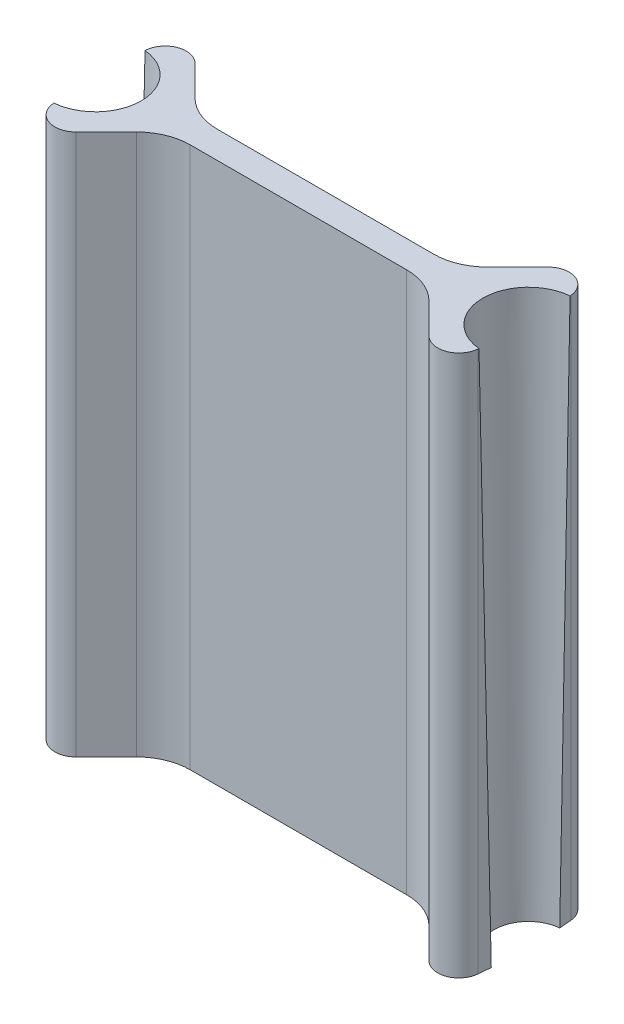
ISO-10303-21;
HEADER;
FILE_DESCRIPTION(('STEP AP214'),'2;1');
FILE_NAME('part.step','',(''),(''),'','','');
FILE_SCHEMA(('AUTOMOTIVE_DESIGN { 1 0 10303 214 1 1 1 1 }'));
ENDSEC;
DATA;
#1=APPLICATION_CONTEXT('core data for automotive mechanical design processes');
#2=APPLICATION_PROTOCOL_DEFINITION('international standard','automotive_design',2000,#1);
#3=PRODUCT_CONTEXT('',#1,'mechanical');
#4=PRODUCT('Part','Part','',(#3));
#5=PRODUCT_RELATED_PRODUCT_CATEGORY('part','',(#4));
#6=PRODUCT_DEFINITION_FORMATION('','',#4);
#7=PRODUCT_DEFINITION_CONTEXT('part definition',#1,'design');
#8=PRODUCT_DEFINITION('design','',#6,#7);
#9=PRODUCT_DEFINITION_SHAPE('','',#8);
#10=(LENGTH_UNIT() NAMED_UNIT(*) SI_UNIT(.MILLI.,.METRE.));
#11=(NAMED_UNIT(*) PLANE_ANGLE_UNIT() SI_UNIT($,.RADIAN.));
#12=(NAMED_UNIT(*) SI_UNIT($,.STERADIAN.) SOLID_ANGLE_UNIT());
#13=UNCERTAINTY_MEASURE_WITH_UNIT(LENGTH_MEASURE(1.E-05),#10,'distance_accuracy_value','');
#14=(GEOMETRIC_REPRESENTATION_CONTEXT(3) GLOBAL_UNCERTAINTY_ASSIGNED_CONTEXT((#13)) GLOBAL_UNIT_ASSIGNED_CONTEXT((#10,
#11,#12)) REPRESENTATION_CONTEXT('',''));
#15=CARTESIAN_POINT('',(0.,0.,0.));
#16=DIRECTION('',(0.,0.,1.));
#17=DIRECTION('',(1.,0.,0.));
#18=AXIS2_PLACEMENT_3D('',#15,#16,#17);
#19=CARTESIAN_POINT('',(7.93923101204884,10.,-0.694592710667681));
#20=DIRECTION('',(-0.996194698091746,0.,0.087155742747653));
#21=DIRECTION('',(0.087155742747653,0.,0.996194698091746));
#22=AXIS2_PLACEMENT_3D('',#19,#20,#21);
#23=PLANE('',#22);
#24=DIRECTION('',(-0.087155742747653,0.,-0.996194698091746));
#25=VECTOR('',#24,1.);
#26=CARTESIAN_POINT('',(7.93923101204884,10.,-0.694592710667681));
#27=LINE('',#26,#25);
#28=CARTESIAN_POINT('',(7.92639957779882,10.,-0.841256675264834));
#29=VERTEX_POINT('',#28);
#30=CARTESIAN_POINT('',(7.92488614141223,10.,-0.858555332320465));
#31=VERTEX_POINT('',#30);
#32=EDGE_CURVE('E133',#29,#31,#27,.T.);
#33=ORIENTED_EDGE('',*,*,#32,.F.);
#34=DIRECTION('',(0.0018252521598672,-0.999780683474845,0.0208627276530114));
#35=VECTOR('',#34,1.);
#36=CARTESIAN_POINT('',(8.,-30.3145833930611,0.));
#37=LINE('',#36,#35);
#38=CARTESIAN_POINT('',(7.94465610335524,0.,-0.632583633288258));
#39=VERTEX_POINT('',#38);
#40=EDGE_CURVE('E441',#39,#29,#37,.F.);
#41=ORIENTED_EDGE('',*,*,#40,.F.);
#42=DIRECTION('',(-0.087155742747653,0.,-0.996194698091746));
#43=VECTOR('',#42,1.);
#44=CARTESIAN_POINT('',(7.93923101204884,0.,-0.694592710667681));
#45=LINE('',#44,#43);
#46=CARTESIAN_POINT('',(7.92488614141223,0.,-0.858555332320465));
#47=VERTEX_POINT('',#46);
#48=EDGE_CURVE('E211',#39,#47,#45,.T.);
#49=ORIENTED_EDGE('',*,*,#48,.T.);
#50=DIRECTION('',(0.,-1.,0.));
#51=VECTOR('',#50,1.);
#52=CARTESIAN_POINT('',(7.92488614141223,10.,-0.858555332320465));
#53=LINE('',#52,#51);
#54=EDGE_CURVE('E11',#31,#47,#53,.T.);
#55=ORIENTED_EDGE('',*,*,#54,.F.);
#56=EDGE_LOOP('',(#33,#41,#49,#55));
#57=FACE_BOUND('',#56,.T.);
#58=ADVANCED_FACE('F43',(#57),#23,.F.);
#59=CARTESIAN_POINT('',(7.53691050638378,10.,-0.824611862531205));
#60=DIRECTION('',(0.,-1.,0.));
#61=DIRECTION('',(0.,0.,-1.));
#62=AXIS2_PLACEMENT_3D('',#59,#60,#61);
#63=CYLINDRICAL_SURFACE('',#62,0.389457638925042);
#64=CARTESIAN_POINT('',(7.53691050638378,0.,-0.824611862531205));
#65=DIRECTION('',(0.,1.,0.));
#66=DIRECTION('',(0.,0.,1.));
#67=AXIS2_PLACEMENT_3D('',#64,#65,#66);
#68=CIRCLE('',#67,0.389457638925042);
#69=CARTESIAN_POINT('',(7.26152236891497,0.,-1.1));
#70=VERTEX_POINT('',#69);
#71=EDGE_CURVE('E215',#47,#70,#68,.T.);
#72=ORIENTED_EDGE('',*,*,#71,.T.);
#73=DIRECTION('',(0.,-1.,0.));
#74=VECTOR('',#73,1.);
#75=CARTESIAN_POINT('',(7.26152236891497,10.,-1.1));
#76=LINE('',#75,#74);
#77=CARTESIAN_POINT('',(7.26152236891497,10.,-1.1));
#78=VERTEX_POINT('',#77);
#79=EDGE_CURVE('E52',#78,#70,#76,.T.);
#80=ORIENTED_EDGE('',*,*,#79,.F.);
#81=CARTESIAN_POINT('',(7.53691050638378,10.,-0.824611862531205));
#82=DIRECTION('',(0.,1.,0.));
#83=DIRECTION('',(0.,0.,1.));
#84=AXIS2_PLACEMENT_3D('',#81,#82,#83);
#85=CIRCLE('',#84,0.389457638925042);
#86=EDGE_CURVE('E345',#31,#78,#85,.T.);
#87=ORIENTED_EDGE('',*,*,#86,.F.);
#88=ORIENTED_EDGE('',*,*,#54,.T.);
#89=EDGE_LOOP('',(#72,#80,#87,#88));
#90=FACE_BOUND('',#89,.T.);
#91=ADVANCED_FACE('F434',(#90),#63,.T.);
#92=CARTESIAN_POINT('',(3.08076118445751,10.,3.08076118445749));
#93=DIRECTION('',(0.70710678118655,0.,0.707106781186545));
#94=DIRECTION('',(0.707106781186545,0.,-0.70710678118655));
#95=AXIS2_PLACEMENT_3D('',#92,#93,#94);
#96=PLANE('',#95);
#97=DIRECTION('',(-0.707106781186545,0.,0.70710678118655));
#98=VECTOR('',#97,1.);
#99=CARTESIAN_POINT('',(3.08076118445751,0.,3.08076118445749));
#100=LINE('',#99,#98);
#101=CARTESIAN_POINT('',(6.70251262658471,0.,-0.540990257669735));
#102=VERTEX_POINT('',#101);
#103=EDGE_CURVE('E219',#70,#102,#100,.T.);
#104=ORIENTED_EDGE('',*,*,#103,.T.);
#105=DIRECTION('',(0.,-1.,0.));
#106=VECTOR('',#105,1.);
#107=CARTESIAN_POINT('',(6.70251262658471,10.,-0.540990257669735));
#108=LINE('',#107,#106);
#109=CARTESIAN_POINT('',(6.70251262658471,10.,-0.540990257669735));
#110=VERTEX_POINT('',#109);
#111=EDGE_CURVE('E312',#110,#102,#108,.T.);
#112=ORIENTED_EDGE('',*,*,#111,.F.);
#113=DIRECTION('',(-0.707106781186545,0.,0.70710678118655));
#114=VECTOR('',#113,1.);
#115=CARTESIAN_POINT('',(3.08076118445751,10.,3.08076118445749));
#116=LINE('',#115,#114);
#117=EDGE_CURVE('E323',#78,#110,#116,.T.);
#118=ORIENTED_EDGE('',*,*,#117,.F.);
#119=ORIENTED_EDGE('',*,*,#79,.T.);
#120=EDGE_LOOP('',(#104,#112,#118,#119));
#121=FACE_BOUND('',#120,.T.);
#122=ADVANCED_FACE('F321',(#121),#96,.F.);
#123=CARTESIAN_POINT('',(6.,10.,-1.24350288425444));
#124=DIRECTION('',(0.,-1.,0.));
#125=DIRECTION('',(0.,0.,-1.));
#126=AXIS2_PLACEMENT_3D('',#123,#124,#125);
#127=CYLINDRICAL_SURFACE('',#126,0.993502884254442);
#128=CARTESIAN_POINT('',(6.,0.,-1.24350288425444));
#129=DIRECTION('',(0.,1.,0.));
#130=DIRECTION('',(0.,0.,1.));
#131=AXIS2_PLACEMENT_3D('',#128,#129,#130);
#132=CIRCLE('',#131,0.993502884254442);
#133=CARTESIAN_POINT('',(6.,0.,-0.249999999999999));
#134=VERTEX_POINT('',#133);
#135=EDGE_CURVE('E222',#102,#134,#132,.F.);
#136=ORIENTED_EDGE('',*,*,#135,.T.);
#137=DIRECTION('',(0.,-1.,0.));
#138=VECTOR('',#137,1.);
#139=CARTESIAN_POINT('',(6.,10.,-0.249999999999999));
#140=LINE('',#139,#138);
#141=CARTESIAN_POINT('',(6.,10.,-0.249999999999999));
#142=VERTEX_POINT('',#141);
#143=EDGE_CURVE('E309',#142,#134,#140,.T.);
#144=ORIENTED_EDGE('',*,*,#143,.F.);
#145=CARTESIAN_POINT('',(6.,10.,-1.24350288425444));
#146=DIRECTION('',(0.,1.,0.));
#147=DIRECTION('',(0.,0.,1.));
#148=AXIS2_PLACEMENT_3D('',#145,#146,#147);
#149=CIRCLE('',#148,0.993502884254442);
#150=EDGE_CURVE('E336',#110,#142,#149,.F.);
#151=ORIENTED_EDGE('',*,*,#150,.F.);
#152=ORIENTED_EDGE('',*,*,#111,.T.);
#153=EDGE_LOOP('',(#136,#144,#151,#152));
#154=FACE_BOUND('',#153,.T.);
#155=ADVANCED_FACE('F333',(#154),#127,.F.);
#156=CARTESIAN_POINT('',(0.,10.,-0.25));
#157=DIRECTION('',(0.,0.,-1.));
#158=DIRECTION('',(-1.,0.,0.));
#159=AXIS2_PLACEMENT_3D('',#156,#157,#158);
#160=PLANE('',#159);
#161=DIRECTION('',(1.,0.,0.));
#162=VECTOR('',#161,1.);
#163=CARTESIAN_POINT('',(0.,0.,-0.25));
#164=LINE('',#163,#162);
#165=CARTESIAN_POINT('',(2.,0.,-0.25));
#166=VERTEX_POINT('',#165);
#167=EDGE_CURVE('E226',#166,#134,#164,.T.);
#168=ORIENTED_EDGE('',*,*,#167,.F.);
#169=DIRECTION('',(0.,-1.,0.));
#170=VECTOR('',#169,1.);
#171=CARTESIAN_POINT('',(2.,10.,-0.25));
#172=LINE('',#171,#170);
#173=CARTESIAN_POINT('',(2.,10.,-0.25));
#174=VERTEX_POINT('',#173);
#175=EDGE_CURVE('E306',#174,#166,#172,.T.);
#176=ORIENTED_EDGE('',*,*,#175,.F.);
#177=DIRECTION('',(1.,0.,0.));
#178=VECTOR('',#177,1.);
#179=CARTESIAN_POINT('',(0.,10.,-0.25));
#180=LINE('',#179,#178);
#181=EDGE_CURVE('E339',#174,#142,#180,.T.);
#182=ORIENTED_EDGE('',*,*,#181,.T.);
#183=ORIENTED_EDGE('',*,*,#143,.T.);
#184=EDGE_LOOP('',(#168,#176,#182,#183));
#185=FACE_BOUND('',#184,.T.);
#186=ADVANCED_FACE('F475',(#185),#160,.T.);
#187=CARTESIAN_POINT('',(2.,10.,-1.24350288425444));
#188=DIRECTION('',(0.,-1.,0.));
#189=DIRECTION('',(0.,0.,-1.));
#190=AXIS2_PLACEMENT_3D('',#187,#188,#189);
#191=CYLINDRICAL_SURFACE('',#190,0.993502884254442);
#192=CARTESIAN_POINT('',(2.,0.,-1.24350288425444));
#193=DIRECTION('',(0.,1.,0.));
#194=DIRECTION('',(0.,0.,1.));
#195=AXIS2_PLACEMENT_3D('',#192,#193,#194);
#196=CIRCLE('',#195,0.993502884254442);
#197=CARTESIAN_POINT('',(1.29748737341529,0.,-0.540990257669733));
#198=VERTEX_POINT('',#197);
#199=EDGE_CURVE('E230',#198,#166,#196,.T.);
#200=ORIENTED_EDGE('',*,*,#199,.F.);
#201=DIRECTION('',(0.,-1.,0.));
#202=VECTOR('',#201,1.);
#203=CARTESIAN_POINT('',(1.29748737341529,10.,-0.540990257669733));
#204=LINE('',#203,#202);
#205=CARTESIAN_POINT('',(1.29748737341529,10.,-0.540990257669733));
#206=VERTEX_POINT('',#205);
#207=EDGE_CURVE('E303',#206,#198,#204,.T.);
#208=ORIENTED_EDGE('',*,*,#207,.F.);
#209=CARTESIAN_POINT('',(2.,10.,-1.24350288425444));
#210=DIRECTION('',(0.,1.,0.));
#211=DIRECTION('',(0.,0.,1.));
#212=AXIS2_PLACEMENT_3D('',#209,#210,#211);
#213=CIRCLE('',#212,0.993502884254442);
#214=EDGE_CURVE('E343',#206,#174,#213,.T.);
#215=ORIENTED_EDGE('',*,*,#214,.T.);
#216=ORIENTED_EDGE('',*,*,#175,.T.);
#217=EDGE_LOOP('',(#200,#208,#215,#216));
#218=FACE_BOUND('',#217,.T.);
#219=ADVANCED_FACE('F473',(#218),#191,.F.);
#220=CARTESIAN_POINT('',(0.919238815542513,10.,-0.919238815542511));
#221=DIRECTION('',(0.707106781186548,0.,-0.707106781186547));
#222=DIRECTION('',(-0.707106781186547,0.,-0.707106781186548));
#223=AXIS2_PLACEMENT_3D('',#220,#221,#222);
#224=PLANE('',#223);
#225=DIRECTION('',(0.707106781186547,0.,0.707106781186548));
#226=VECTOR('',#225,1.);
#227=CARTESIAN_POINT('',(0.919238815542513,0.,-0.919238815542511));
#228=LINE('',#227,#226);
#229=CARTESIAN_POINT('',(0.738477631085024,0.,-1.1));
#230=VERTEX_POINT('',#229);
#231=EDGE_CURVE('E234',#230,#198,#228,.T.);
#232=ORIENTED_EDGE('',*,*,#231,.F.);
#233=DIRECTION('',(0.,-1.,0.));
#234=VECTOR('',#233,1.);
#235=CARTESIAN_POINT('',(0.738477631085024,10.,-1.1));
#236=LINE('',#235,#234);
#237=CARTESIAN_POINT('',(0.738477631085024,10.,-1.1));
#238=VERTEX_POINT('',#237);
#239=EDGE_CURVE('E300',#238,#230,#236,.T.);
#240=ORIENTED_EDGE('',*,*,#239,.F.);
#241=DIRECTION('',(0.707106781186547,0.,0.707106781186548));
#242=VECTOR('',#241,1.);
#243=CARTESIAN_POINT('',(0.919238815542513,10.,-0.919238815542511));
#244=LINE('',#243,#242);
#245=EDGE_CURVE('E352',#238,#206,#244,.T.);
#246=ORIENTED_EDGE('',*,*,#245,.T.);
#247=ORIENTED_EDGE('',*,*,#207,.T.);
#248=EDGE_LOOP('',(#232,#240,#246,#247));
#249=FACE_BOUND('',#248,.T.);
#250=ADVANCED_FACE('F471',(#249),#224,.T.);
#251=CARTESIAN_POINT('',(0.463089493616225,10.,-0.824611862531202));
#252=DIRECTION('',(0.,-1.,0.));
#253=DIRECTION('',(0.,0.,-1.));
#254=AXIS2_PLACEMENT_3D('',#251,#252,#253);
#255=CYLINDRICAL_SURFACE('',#254,0.389457638925041);
#256=CARTESIAN_POINT('',(0.463089493616225,0.,-0.824611862531202));
#257=DIRECTION('',(0.,1.,0.));
#258=DIRECTION('',(0.,0.,1.));
#259=AXIS2_PLACEMENT_3D('',#256,#257,#258);
#260=CIRCLE('',#259,0.389457638925041);
#261=CARTESIAN_POINT('',(0.0751138585877695,0.,-0.858555332320462));
#262=VERTEX_POINT('',#261);
#263=EDGE_CURVE('E238',#262,#230,#260,.F.);
#264=ORIENTED_EDGE('',*,*,#263,.F.);
#265=DIRECTION('',(0.,-1.,0.));
#266=VECTOR('',#265,1.);
#267=CARTESIAN_POINT('',(0.0751138585877695,10.,-0.858555332320462));
#268=LINE('',#267,#266);
#269=CARTESIAN_POINT('',(0.0751138585877695,10.,-0.858555332320462));
#270=VERTEX_POINT('',#269);
#271=EDGE_CURVE('E297',#270,#262,#268,.T.);
#272=ORIENTED_EDGE('',*,*,#271,.F.);
#273=CARTESIAN_POINT('',(0.463089493616225,10.,-0.824611862531202));
#274=DIRECTION('',(0.,1.,0.));
#275=DIRECTION('',(0.,0.,1.));
#276=AXIS2_PLACEMENT_3D('',#273,#274,#275);
#277=CIRCLE('',#276,0.389457638925041);
#278=EDGE_CURVE('E356',#270,#238,#277,.F.);
#279=ORIENTED_EDGE('',*,*,#278,.T.);
#280=ORIENTED_EDGE('',*,*,#239,.T.);
#281=EDGE_LOOP('',(#264,#272,#279,#280));
#282=FACE_BOUND('',#281,.T.);
#283=ADVANCED_FACE('F467',(#282),#255,.T.);
#284=CARTESIAN_POINT('',(0.,10.,0.));
#285=DIRECTION('',(-0.996194698091746,0.,-0.0871557427476544));
#286=DIRECTION('',(-0.0871557427476544,0.,0.996194698091746));
#287=AXIS2_PLACEMENT_3D('',#284,#285,#286);
#288=PLANE('',#287);
#289=DIRECTION('',(-0.00182525215986723,-0.999780683474846,0.0208627276530114));
#290=VECTOR('',#289,1.);
#291=CARTESIAN_POINT('',(0.,-30.3145833930611,0.));
#292=LINE('',#291,#290);
#293=CARTESIAN_POINT('',(0.0553438966447605,0.,-0.632583633288259));
#294=VERTEX_POINT('',#293);
#295=CARTESIAN_POINT('',(0.0736004222011792,10.,-0.841256675264832));
#296=VERTEX_POINT('',#295);
#297=EDGE_CURVE('E407',#294,#296,#292,.F.);
#298=ORIENTED_EDGE('',*,*,#297,.T.);
#299=DIRECTION('',(0.0871557427476544,0.,-0.996194698091746));
#300=VECTOR('',#299,1.);
#301=CARTESIAN_POINT('',(0.,10.,0.));
#302=LINE('',#301,#300);
#303=EDGE_CURVE('E360',#296,#270,#302,.T.);
#304=ORIENTED_EDGE('',*,*,#303,.T.);
#305=ORIENTED_EDGE('',*,*,#271,.T.);
#306=DIRECTION('',(0.0871557427476544,0.,-0.996194698091746));
#307=VECTOR('',#306,1.);
#308=CARTESIAN_POINT('',(0.,0.,0.));
#309=LINE('',#308,#307);
#310=EDGE_CURVE('E242',#294,#262,#309,.T.);
#311=ORIENTED_EDGE('',*,*,#310,.F.);
#312=EDGE_LOOP('',(#298,#304,#305,#311));
#313=FACE_BOUND('',#312,.T.);
#314=ADVANCED_FACE('F460',(#313),#288,.T.);
#315=CARTESIAN_POINT('',(0.,10.,0.));
#316=DIRECTION('',(0.996194698091746,0.,-0.0871557427476544));
#317=DIRECTION('',(-0.0871557427476544,0.,-0.996194698091746));
#318=AXIS2_PLACEMENT_3D('',#315,#316,#317);
#319=PLANE('',#318);
#320=DIRECTION('',(0.0871557427476544,0.,0.996194698091746));
#321=VECTOR('',#320,1.);
#322=CARTESIAN_POINT('',(0.,10.,0.));
#323=LINE('',#322,#321);
#324=CARTESIAN_POINT('',(0.0736004222011792,10.,0.841256675264832));
#325=VERTEX_POINT('',#324);
#326=CARTESIAN_POINT('',(0.0751138585877695,10.,0.858555332320462));
#327=VERTEX_POINT('',#326);
#328=EDGE_CURVE('E363',#325,#327,#323,.T.);
#329=ORIENTED_EDGE('',*,*,#328,.F.);
#330=DIRECTION('',(-0.00182525215986723,-0.999780683474846,-0.0208627276530114));
#331=VECTOR('',#330,1.);
#332=CARTESIAN_POINT('',(0.,-30.3145833930611,0.));
#333=LINE('',#332,#331);
#334=CARTESIAN_POINT('',(0.0553438966447605,0.,0.632583633288259));
#335=VERTEX_POINT('',#334);
#336=EDGE_CURVE('E405',#335,#325,#333,.F.);
#337=ORIENTED_EDGE('',*,*,#336,.F.);
#338=DIRECTION('',(0.0871557427476544,0.,0.996194698091746));
#339=VECTOR('',#338,1.);
#340=CARTESIAN_POINT('',(0.,0.,0.));
#341=LINE('',#340,#339);
#342=CARTESIAN_POINT('',(0.0751138585877695,0.,0.858555332320462));
#343=VERTEX_POINT('',#342);
#344=EDGE_CURVE('E246',#335,#343,#341,.T.);
#345=ORIENTED_EDGE('',*,*,#344,.T.);
#346=DIRECTION('',(0.,-1.,0.));
#347=VECTOR('',#346,1.);
#348=CARTESIAN_POINT('',(0.0751138585877695,10.,0.858555332320462));
#349=LINE('',#348,#347);
#350=EDGE_CURVE('E293',#327,#343,#349,.T.);
#351=ORIENTED_EDGE('',*,*,#350,.F.);
#352=EDGE_LOOP('',(#329,#337,#345,#351));
#353=FACE_BOUND('',#352,.T.);
#354=ADVANCED_FACE('F413',(#353),#319,.F.);
#355=CARTESIAN_POINT('',(0.463089493616225,10.,0.824611862531202));
#356=DIRECTION('',(0.,-1.,0.));
#357=DIRECTION('',(0.,0.,-1.));
#358=AXIS2_PLACEMENT_3D('',#355,#356,#357);
#359=CYLINDRICAL_SURFACE('',#358,0.389457638925041);
#360=CARTESIAN_POINT('',(0.463089493616225,0.,0.824611862531202));
#361=DIRECTION('',(0.,1.,0.));
#362=DIRECTION('',(0.,0.,1.));
#363=AXIS2_PLACEMENT_3D('',#360,#361,#362);
#364=CIRCLE('',#363,0.389457638925041);
#365=CARTESIAN_POINT('',(0.738477631085024,0.,1.1));
#366=VERTEX_POINT('',#365);
#367=EDGE_CURVE('E249',#343,#366,#364,.T.);
#368=ORIENTED_EDGE('',*,*,#367,.T.);
#369=DIRECTION('',(0.,-1.,0.));
#370=VECTOR('',#369,1.);
#371=CARTESIAN_POINT('',(0.738477631085024,10.,1.1));
#372=LINE('',#371,#370);
#373=CARTESIAN_POINT('',(0.738477631085024,10.,1.1));
#374=VERTEX_POINT('',#373);
#375=EDGE_CURVE('E289',#374,#366,#372,.T.);
#376=ORIENTED_EDGE('',*,*,#375,.F.);
#377=CARTESIAN_POINT('',(0.463089493616225,10.,0.824611862531202));
#378=DIRECTION('',(0.,1.,0.));
#379=DIRECTION('',(0.,0.,1.));
#380=AXIS2_PLACEMENT_3D('',#377,#378,#379);
#381=CIRCLE('',#380,0.389457638925041);
#382=EDGE_CURVE('E366',#327,#374,#381,.T.);
#383=ORIENTED_EDGE('',*,*,#382,.F.);
#384=ORIENTED_EDGE('',*,*,#350,.T.);
#385=EDGE_LOOP('',(#368,#376,#383,#384));
#386=FACE_BOUND('',#385,.T.);
#387=ADVANCED_FACE('F421',(#386),#359,.T.);
#388=CARTESIAN_POINT('',(0.919238815542512,10.,0.919238815542512));
#389=DIRECTION('',(-0.707106781186548,0.,-0.707106781186547));
#390=DIRECTION('',(-0.707106781186547,0.,0.707106781186548));
#391=AXIS2_PLACEMENT_3D('',#388,#389,#390);
#392=PLANE('',#391);
#393=DIRECTION('',(0.707106781186547,0.,-0.707106781186548));
#394=VECTOR('',#393,1.);
#395=CARTESIAN_POINT('',(0.919238815542512,0.,0.919238815542512));
#396=LINE('',#395,#394);
#397=CARTESIAN_POINT('',(1.29748737341529,0.,0.540990257669734));
#398=VERTEX_POINT('',#397);
#399=EDGE_CURVE('E252',#366,#398,#396,.T.);
#400=ORIENTED_EDGE('',*,*,#399,.T.);
#401=DIRECTION('',(0.,-1.,0.));
#402=VECTOR('',#401,1.);
#403=CARTESIAN_POINT('',(1.29748737341529,10.,0.540990257669734));
#404=LINE('',#403,#402);
#405=CARTESIAN_POINT('',(1.29748737341529,10.,0.540990257669734));
#406=VERTEX_POINT('',#405);
#407=EDGE_CURVE('E285',#406,#398,#404,.T.);
#408=ORIENTED_EDGE('',*,*,#407,.F.);
#409=DIRECTION('',(0.707106781186547,0.,-0.707106781186548));
#410=VECTOR('',#409,1.);
#411=CARTESIAN_POINT('',(0.919238815542512,10.,0.919238815542512));
#412=LINE('',#411,#410);
#413=EDGE_CURVE('E369',#374,#406,#412,.T.);
#414=ORIENTED_EDGE('',*,*,#413,.F.);
#415=ORIENTED_EDGE('',*,*,#375,.T.);
#416=EDGE_LOOP('',(#400,#408,#414,#415));
#417=FACE_BOUND('',#416,.T.);
#418=ADVANCED_FACE('F424',(#417),#392,.F.);
#419=CARTESIAN_POINT('',(2.,10.,1.24350288425444));
#420=DIRECTION('',(0.,-1.,0.));
#421=DIRECTION('',(0.,0.,-1.));
#422=AXIS2_PLACEMENT_3D('',#419,#420,#421);
#423=CYLINDRICAL_SURFACE('',#422,0.993502884254442);
#424=CARTESIAN_POINT('',(2.,0.,1.24350288425444));
#425=DIRECTION('',(0.,1.,0.));
#426=DIRECTION('',(0.,0.,1.));
#427=AXIS2_PLACEMENT_3D('',#424,#425,#426);
#428=CIRCLE('',#427,0.993502884254442);
#429=CARTESIAN_POINT('',(2.,0.,0.25));
#430=VERTEX_POINT('',#429);
#431=EDGE_CURVE('E255',#398,#430,#428,.F.);
#432=ORIENTED_EDGE('',*,*,#431,.T.);
#433=DIRECTION('',(0.,-1.,0.));
#434=VECTOR('',#433,1.);
#435=CARTESIAN_POINT('',(2.,10.,0.25));
#436=LINE('',#435,#434);
#437=CARTESIAN_POINT('',(2.,10.,0.25));
#438=VERTEX_POINT('',#437);
#439=EDGE_CURVE('E281',#438,#430,#436,.T.);
#440=ORIENTED_EDGE('',*,*,#439,.F.);
#441=CARTESIAN_POINT('',(2.,10.,1.24350288425444));
#442=DIRECTION('',(0.,1.,0.));
#443=DIRECTION('',(0.,0.,1.));
#444=AXIS2_PLACEMENT_3D('',#441,#442,#443);
#445=CIRCLE('',#444,0.993502884254442);
#446=EDGE_CURVE('E372',#406,#438,#445,.F.);
#447=ORIENTED_EDGE('',*,*,#446,.F.);
#448=ORIENTED_EDGE('',*,*,#407,.T.);
#449=EDGE_LOOP('',(#432,#440,#447,#448));
#450=FACE_BOUND('',#449,.T.);
#451=ADVANCED_FACE('F380',(#450),#423,.F.);
#452=CARTESIAN_POINT('',(0.,10.,0.25));
#453=DIRECTION('',(0.,0.,-1.));
#454=DIRECTION('',(-1.,0.,0.));
#455=AXIS2_PLACEMENT_3D('',#452,#453,#454);
#456=PLANE('',#455);
#457=DIRECTION('',(1.,0.,0.));
#458=VECTOR('',#457,1.);
#459=CARTESIAN_POINT('',(0.,0.,0.25));
#460=LINE('',#459,#458);
#461=CARTESIAN_POINT('',(6.,0.,0.249999999999999));
#462=VERTEX_POINT('',#461);
#463=EDGE_CURVE('E258',#430,#462,#460,.T.);
#464=ORIENTED_EDGE('',*,*,#463,.T.);
#465=DIRECTION('',(0.,-1.,0.));
#466=VECTOR('',#465,1.);
#467=CARTESIAN_POINT('',(6.,10.,0.249999999999999));
#468=LINE('',#467,#466);
#469=CARTESIAN_POINT('',(6.,10.,0.249999999999999));
#470=VERTEX_POINT('',#469);
#471=EDGE_CURVE('E187',#470,#462,#468,.T.);
#472=ORIENTED_EDGE('',*,*,#471,.F.);
#473=DIRECTION('',(1.,0.,0.));
#474=VECTOR('',#473,1.);
#475=CARTESIAN_POINT('',(0.,10.,0.25));
#476=LINE('',#475,#474);
#477=EDGE_CURVE('E197',#438,#470,#476,.T.);
#478=ORIENTED_EDGE('',*,*,#477,.F.);
#479=ORIENTED_EDGE('',*,*,#439,.T.);
#480=EDGE_LOOP('',(#464,#472,#478,#479));
#481=FACE_BOUND('',#480,.T.);
#482=ADVANCED_FACE('F384',(#481),#456,.F.);
#483=CARTESIAN_POINT('',(6.,10.,1.24350288425444));
#484=DIRECTION('',(0.,-1.,0.));
#485=DIRECTION('',(0.,0.,-1.));
#486=AXIS2_PLACEMENT_3D('',#483,#484,#485);
#487=CYLINDRICAL_SURFACE('',#486,0.993502884254441);
#488=CARTESIAN_POINT('',(6.,0.,1.24350288425444));
#489=DIRECTION('',(0.,1.,0.));
#490=DIRECTION('',(0.,0.,1.));
#491=AXIS2_PLACEMENT_3D('',#488,#489,#490);
#492=CIRCLE('',#491,0.993502884254441);
#493=CARTESIAN_POINT('',(6.70251262658471,0.,0.540990257669735));
#494=VERTEX_POINT('',#493);
#495=EDGE_CURVE('E181',#494,#462,#492,.T.);
#496=ORIENTED_EDGE('',*,*,#495,.F.);
#497=DIRECTION('',(0.,-1.,0.));
#498=VECTOR('',#497,1.);
#499=CARTESIAN_POINT('',(6.70251262658471,10.,0.540990257669735));
#500=LINE('',#499,#498);
#501=CARTESIAN_POINT('',(6.70251262658471,10.,0.540990257669735));
#502=VERTEX_POINT('',#501);
#503=EDGE_CURVE('E176',#502,#494,#500,.T.);
#504=ORIENTED_EDGE('',*,*,#503,.F.);
#505=CARTESIAN_POINT('',(6.,10.,1.24350288425444));
#506=DIRECTION('',(0.,1.,0.));
#507=DIRECTION('',(0.,0.,1.));
#508=AXIS2_PLACEMENT_3D('',#505,#506,#507);
#509=CIRCLE('',#508,0.993502884254441);
#510=EDGE_CURVE('E179',#502,#470,#509,.T.);
#511=ORIENTED_EDGE('',*,*,#510,.T.);
#512=ORIENTED_EDGE('',*,*,#471,.T.);
#513=EDGE_LOOP('',(#496,#504,#511,#512));
#514=FACE_BOUND('',#513,.T.);
#515=ADVANCED_FACE('F178',(#514),#487,.F.);
#516=CARTESIAN_POINT('',(3.08076118445751,10.,-3.08076118445749));
#517=DIRECTION('',(-0.70710678118655,0.,0.707106781186545));
#518=DIRECTION('',(0.707106781186545,0.,0.70710678118655));
#519=AXIS2_PLACEMENT_3D('',#516,#517,#518);
#520=PLANE('',#519);
#521=DIRECTION('',(-0.707106781186545,0.,-0.70710678118655));
#522=VECTOR('',#521,1.);
#523=CARTESIAN_POINT('',(3.08076118445751,0.,-3.08076118445749));
#524=LINE('',#523,#522);
#525=CARTESIAN_POINT('',(7.26152236891497,0.,1.1));
#526=VERTEX_POINT('',#525);
#527=EDGE_CURVE('E264',#526,#494,#524,.T.);
#528=ORIENTED_EDGE('',*,*,#527,.F.);
#529=DIRECTION('',(0.,-1.,0.));
#530=VECTOR('',#529,1.);
#531=CARTESIAN_POINT('',(7.26152236891497,10.,1.1));
#532=LINE('',#531,#530);
#533=CARTESIAN_POINT('',(7.26152236891497,10.,1.1));
#534=VERTEX_POINT('',#533);
#535=EDGE_CURVE('E188',#534,#526,#532,.T.);
#536=ORIENTED_EDGE('',*,*,#535,.F.);
#537=DIRECTION('',(-0.707106781186545,0.,-0.70710678118655));
#538=VECTOR('',#537,1.);
#539=CARTESIAN_POINT('',(3.08076118445751,10.,-3.08076118445749));
#540=LINE('',#539,#538);
#541=EDGE_CURVE('E194',#534,#502,#540,.T.);
#542=ORIENTED_EDGE('',*,*,#541,.T.);
#543=ORIENTED_EDGE('',*,*,#503,.T.);
#544=EDGE_LOOP('',(#528,#536,#542,#543));
#545=FACE_BOUND('',#544,.T.);
#546=ADVANCED_FACE('F201',(#545),#520,.T.);
#547=CARTESIAN_POINT('',(7.53691050638378,10.,0.824611862531203));
#548=DIRECTION('',(0.,-1.,0.));
#549=DIRECTION('',(0.,0.,-1.));
#550=AXIS2_PLACEMENT_3D('',#547,#548,#549);
#551=CYLINDRICAL_SURFACE('',#550,0.389457638925043);
#552=CARTESIAN_POINT('',(7.53691050638378,0.,0.824611862531203));
#553=DIRECTION('',(0.,1.,0.));
#554=DIRECTION('',(0.,0.,1.));
#555=AXIS2_PLACEMENT_3D('',#552,#553,#554);
#556=CIRCLE('',#555,0.389457638925043);
#557=CARTESIAN_POINT('',(7.92488614141223,0.,0.858555332320465));
#558=VERTEX_POINT('',#557);
#559=EDGE_CURVE('E267',#558,#526,#556,.F.);
#560=ORIENTED_EDGE('',*,*,#559,.F.);
#561=DIRECTION('',(0.,-1.,0.));
#562=VECTOR('',#561,1.);
#563=CARTESIAN_POINT('',(7.92488614141223,10.,0.858555332320465));
#564=LINE('',#563,#562);
#565=CARTESIAN_POINT('',(7.92488614141223,10.,0.858555332320465));
#566=VERTEX_POINT('',#565);
#567=EDGE_CURVE('E117',#566,#558,#564,.T.);
#568=ORIENTED_EDGE('',*,*,#567,.F.);
#569=CARTESIAN_POINT('',(7.53691050638378,10.,0.824611862531203));
#570=DIRECTION('',(0.,1.,0.));
#571=DIRECTION('',(0.,0.,1.));
#572=AXIS2_PLACEMENT_3D('',#569,#570,#571);
#573=CIRCLE('',#572,0.389457638925043);
#574=EDGE_CURVE('E203',#566,#534,#573,.F.);
#575=ORIENTED_EDGE('',*,*,#574,.T.);
#576=ORIENTED_EDGE('',*,*,#535,.T.);
#577=EDGE_LOOP('',(#560,#568,#575,#576));
#578=FACE_BOUND('',#577,.T.);
#579=ADVANCED_FACE('F386',(#578),#551,.T.);
#580=CARTESIAN_POINT('',(7.93923101204884,10.,0.694592710667681));
#581=DIRECTION('',(0.996194698091746,0.,0.087155742747653));
#582=DIRECTION('',(0.087155742747653,0.,-0.996194698091746));
#583=AXIS2_PLACEMENT_3D('',#580,#581,#582);
#584=PLANE('',#583);
#585=DIRECTION('',(0.0018252521598672,-0.999780683474845,-0.0208627276530114));
#586=VECTOR('',#585,1.);
#587=CARTESIAN_POINT('',(8.,-30.3145833930611,0.));
#588=LINE('',#587,#586);
#589=CARTESIAN_POINT('',(7.94465610335524,0.,0.632583633288258));
#590=VERTEX_POINT('',#589);
#591=CARTESIAN_POINT('',(7.92639957779882,10.,0.841256675264832));
#592=VERTEX_POINT('',#591);
#593=EDGE_CURVE('E124',#590,#592,#588,.F.);
#594=ORIENTED_EDGE('',*,*,#593,.T.);
#595=DIRECTION('',(-0.087155742747653,0.,0.996194698091746));
#596=VECTOR('',#595,1.);
#597=CARTESIAN_POINT('',(7.93923101204884,10.,0.694592710667681));
#598=LINE('',#597,#596);
#599=EDGE_CURVE('E60',#592,#566,#598,.T.);
#600=ORIENTED_EDGE('',*,*,#599,.T.);
#601=ORIENTED_EDGE('',*,*,#567,.T.);
#602=DIRECTION('',(-0.087155742747653,0.,0.996194698091746));
#603=VECTOR('',#602,1.);
#604=CARTESIAN_POINT('',(7.93923101204884,0.,0.694592710667681));
#605=LINE('',#604,#603);
#606=EDGE_CURVE('E271',#590,#558,#605,.T.);
#607=ORIENTED_EDGE('',*,*,#606,.F.);
#608=EDGE_LOOP('',(#594,#600,#601,#607));
#609=FACE_BOUND('',#608,.T.);
#610=ADVANCED_FACE('F572',(#609),#584,.T.);
#611=CARTESIAN_POINT('',(0.,10.,0.));
#612=DIRECTION('',(0.,1.,0.));
#613=DIRECTION('',(0.,0.,1.));
#614=AXIS2_PLACEMENT_3D('',#611,#612,#613);
#615=PLANE('',#614);
#616=CARTESIAN_POINT('',(0.,10.,0.));
#617=DIRECTION('',(0.,1.,0.));
#618=DIRECTION('',(0.,0.,1.));
#619=AXIS2_PLACEMENT_3D('',#616,#617,#618);
#620=CIRCLE('',#619,0.8444701390966);
#621=EDGE_CURVE('E216',#296,#325,#620,.F.);
#622=ORIENTED_EDGE('',*,*,#621,.T.);
#623=ORIENTED_EDGE('',*,*,#328,.T.);
#624=ORIENTED_EDGE('',*,*,#382,.T.);
#625=ORIENTED_EDGE('',*,*,#413,.T.);
#626=ORIENTED_EDGE('',*,*,#446,.T.);
#627=ORIENTED_EDGE('',*,*,#477,.T.);
#628=ORIENTED_EDGE('',*,*,#510,.F.);
#629=ORIENTED_EDGE('',*,*,#541,.F.);
#630=ORIENTED_EDGE('',*,*,#574,.F.);
#631=ORIENTED_EDGE('',*,*,#599,.F.);
#632=CARTESIAN_POINT('',(8.,10.,0.));
#633=DIRECTION('',(0.,1.,0.));
#634=DIRECTION('',(0.,0.,1.));
#635=AXIS2_PLACEMENT_3D('',#632,#633,#634);
#636=CIRCLE('',#635,0.844470139096601);
#637=EDGE_CURVE('E388',#592,#29,#636,.F.);
#638=ORIENTED_EDGE('',*,*,#637,.T.);
#639=ORIENTED_EDGE('',*,*,#32,.T.);
#640=ORIENTED_EDGE('',*,*,#86,.T.);
#641=ORIENTED_EDGE('',*,*,#117,.T.);
#642=ORIENTED_EDGE('',*,*,#150,.T.);
#643=ORIENTED_EDGE('',*,*,#181,.F.);
#644=ORIENTED_EDGE('',*,*,#214,.F.);
#645=ORIENTED_EDGE('',*,*,#245,.F.);
#646=ORIENTED_EDGE('',*,*,#278,.F.);
#647=ORIENTED_EDGE('',*,*,#303,.F.);
#648=EDGE_LOOP('',(#622,#623,#624,#625,#626,#627,#628,#629,#630,#631,#638,#639,#640,#641,#642,
#643,#644,#645,#646,#647));
#649=FACE_BOUND('',#648,.T.);
#650=ADVANCED_FACE('F192',(#649),#615,.T.);
#651=CARTESIAN_POINT('',(0.,0.,0.));
#652=DIRECTION('',(0.,1.,0.));
#653=DIRECTION('',(0.,0.,1.));
#654=AXIS2_PLACEMENT_3D('',#651,#652,#653);
#655=PLANE('',#654);
#656=ORIENTED_EDGE('',*,*,#344,.F.);
#657=CARTESIAN_POINT('',(0.,0.,0.));
#658=DIRECTION('',(0.,-1.,0.));
#659=DIRECTION('',(0.,0.,-1.));
#660=AXIS2_PLACEMENT_3D('',#657,#658,#659);
#661=CIRCLE('',#660,0.635);
#662=EDGE_CURVE('E402',#294,#335,#661,.T.);
#663=ORIENTED_EDGE('',*,*,#662,.F.);
#664=ORIENTED_EDGE('',*,*,#310,.T.);
#665=ORIENTED_EDGE('',*,*,#263,.T.);
#666=ORIENTED_EDGE('',*,*,#231,.T.);
#667=ORIENTED_EDGE('',*,*,#199,.T.);
#668=ORIENTED_EDGE('',*,*,#167,.T.);
#669=ORIENTED_EDGE('',*,*,#135,.F.);
#670=ORIENTED_EDGE('',*,*,#103,.F.);
#671=ORIENTED_EDGE('',*,*,#71,.F.);
#672=ORIENTED_EDGE('',*,*,#48,.F.);
#673=CARTESIAN_POINT('',(8.,0.,0.));
#674=DIRECTION('',(0.,-1.,0.));
#675=DIRECTION('',(0.,0.,-1.));
#676=AXIS2_PLACEMENT_3D('',#673,#674,#675);
#677=CIRCLE('',#676,0.635000000000001);
#678=EDGE_CURVE('E448',#590,#39,#677,.T.);
#679=ORIENTED_EDGE('',*,*,#678,.F.);
#680=ORIENTED_EDGE('',*,*,#606,.T.);
#681=ORIENTED_EDGE('',*,*,#559,.T.);
#682=ORIENTED_EDGE('',*,*,#527,.T.);
#683=ORIENTED_EDGE('',*,*,#495,.T.);
#684=ORIENTED_EDGE('',*,*,#463,.F.);
#685=ORIENTED_EDGE('',*,*,#431,.F.);
#686=ORIENTED_EDGE('',*,*,#399,.F.);
#687=ORIENTED_EDGE('',*,*,#367,.F.);
#688=EDGE_LOOP('',(#656,#663,#664,#665,#666,#667,#668,#669,#670,#671,#672,#679,#680,#681,#682,
#683,#684,#685,#686,#687));
#689=FACE_BOUND('',#688,.T.);
#690=ADVANCED_FACE('F328',(#689),#655,.F.);
#691=CARTESIAN_POINT('',(8.,0.,0.));
#692=DIRECTION('',(0.,1.,0.));
#693=DIRECTION('',(0.,0.,-1.));
#694=AXIS2_PLACEMENT_3D('',#691,#692,#693);
#695=CONICAL_SURFACE('',#694,0.635000000000001,0.020943951023932);
#696=ORIENTED_EDGE('',*,*,#40,.T.);
#697=ORIENTED_EDGE('',*,*,#637,.F.);
#698=ORIENTED_EDGE('',*,*,#593,.F.);
#699=ORIENTED_EDGE('',*,*,#678,.T.);
#700=EDGE_LOOP('',(#696,#697,#698,#699));
#701=FACE_BOUND('',#700,.T.);
#702=ADVANCED_FACE('F619',(#701),#695,.F.);
#703=CARTESIAN_POINT('',(0.,0.,0.));
#704=DIRECTION('',(0.,1.,0.));
#705=DIRECTION('',(0.,0.,-1.));
#706=AXIS2_PLACEMENT_3D('',#703,#704,#705);
#707=CONICAL_SURFACE('',#706,0.635,0.020943951023932);
#708=ORIENTED_EDGE('',*,*,#662,.T.);
#709=ORIENTED_EDGE('',*,*,#336,.T.);
#710=ORIENTED_EDGE('',*,*,#621,.F.);
#711=ORIENTED_EDGE('',*,*,#297,.F.);
#712=EDGE_LOOP('',(#708,#709,#710,#711));
#713=FACE_BOUND('',#712,.T.);
#714=ADVANCED_FACE('F404',(#713),#707,.F.);
#715=CLOSED_SHELL('',(#58,#91,#122,#155,#186,#219,#250,#283,#314,#354,#387,#418,#451,#482,#515,
#546,#579,#610,#650,#690,#702,#714));
#716=MANIFOLD_SOLID_BREP('B2',#715);
#717=ADVANCED_BREP_SHAPE_REPRESENTATION('',(#18,#716),#14);
#718=SHAPE_DEFINITION_REPRESENTATION(#9,#717);
ENDSEC;
END-ISO-10303-21;
